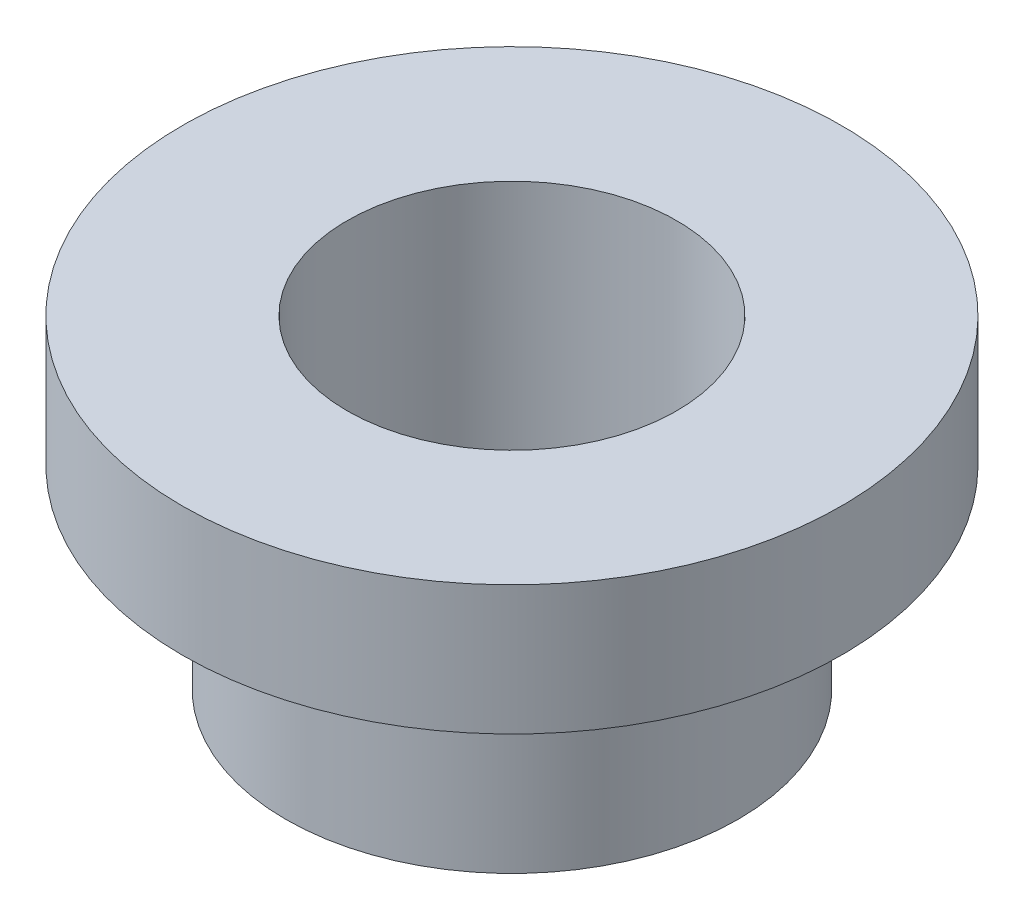
ISO-10303-21;
HEADER;
FILE_DESCRIPTION(('STEP AP214'),'2;1');
FILE_NAME('part.step','',(''),(''),'','','');
FILE_SCHEMA(('AUTOMOTIVE_DESIGN { 1 0 10303 214 1 1 1 1 }'));
ENDSEC;
DATA;
#1=APPLICATION_CONTEXT('core data for automotive mechanical design processes');
#2=APPLICATION_PROTOCOL_DEFINITION('international standard','automotive_design',2000,#1);
#3=PRODUCT_CONTEXT('',#1,'mechanical');
#4=PRODUCT('Part','Part','',(#3));
#5=PRODUCT_RELATED_PRODUCT_CATEGORY('part','',(#4));
#6=PRODUCT_DEFINITION_FORMATION('','',#4);
#7=PRODUCT_DEFINITION_CONTEXT('part definition',#1,'design');
#8=PRODUCT_DEFINITION('design','',#6,#7);
#9=PRODUCT_DEFINITION_SHAPE('','',#8);
#10=(LENGTH_UNIT() NAMED_UNIT(*) SI_UNIT(.MILLI.,.METRE.));
#11=(NAMED_UNIT(*) PLANE_ANGLE_UNIT() SI_UNIT($,.RADIAN.));
#12=(NAMED_UNIT(*) SI_UNIT($,.STERADIAN.) SOLID_ANGLE_UNIT());
#13=UNCERTAINTY_MEASURE_WITH_UNIT(LENGTH_MEASURE(1.E-05),#10,'distance_accuracy_value','');
#14=(GEOMETRIC_REPRESENTATION_CONTEXT(3) GLOBAL_UNCERTAINTY_ASSIGNED_CONTEXT((#13)) GLOBAL_UNIT_ASSIGNED_CONTEXT((#10,
#11,#12)) REPRESENTATION_CONTEXT('',''));
#15=CARTESIAN_POINT('',(0.,0.,0.));
#16=DIRECTION('',(0.,0.,1.));
#17=DIRECTION('',(1.,0.,0.));
#18=AXIS2_PLACEMENT_3D('',#15,#16,#17);
#19=CARTESIAN_POINT('',(0.,8.76171662125341,0.));
#20=DIRECTION('',(0.,1.,0.));
#21=DIRECTION('',(0.,0.,1.));
#22=AXIS2_PLACEMENT_3D('',#19,#20,#21);
#23=CYLINDRICAL_SURFACE('',#22,2.55);
#24=CARTESIAN_POINT('',(0.,-2.5,0.));
#25=DIRECTION('',(0.,1.,0.));
#26=DIRECTION('',(0.,0.,1.));
#27=AXIS2_PLACEMENT_3D('',#24,#25,#26);
#28=CIRCLE('',#27,2.55);
#29=CARTESIAN_POINT('',(0.,-2.5,2.55));
#30=VERTEX_POINT('',#29);
#31=EDGE_CURVE('E55',#30,#30,#28,.T.);
#32=ORIENTED_EDGE('',*,*,#31,.F.);
#33=EDGE_LOOP('',(#32));
#34=FACE_BOUND('',#33,.T.);
#35=CARTESIAN_POINT('',(0.,2.5,0.));
#36=DIRECTION('',(0.,1.,0.));
#37=DIRECTION('',(0.,0.,1.));
#38=AXIS2_PLACEMENT_3D('',#35,#36,#37);
#39=CIRCLE('',#38,2.55);
#40=CARTESIAN_POINT('',(0.,2.5,2.55));
#41=VERTEX_POINT('',#40);
#42=EDGE_CURVE('E10',#41,#41,#39,.T.);
#43=ORIENTED_EDGE('',*,*,#42,.T.);
#44=EDGE_LOOP('',(#43));
#45=FACE_BOUND('',#44,.T.);
#46=ADVANCED_FACE('F33',(#34,#45),#23,.F.);
#47=CARTESIAN_POINT('',(0.,2.5,-2.55));
#48=DIRECTION('',(0.,-1.,0.));
#49=DIRECTION('',(0.,0.,-1.));
#50=AXIS2_PLACEMENT_3D('',#47,#48,#49);
#51=PLANE('',#50);
#52=ORIENTED_EDGE('',*,*,#42,.F.);
#53=EDGE_LOOP('',(#52));
#54=FACE_BOUND('',#53,.T.);
#55=CARTESIAN_POINT('',(0.,2.5,0.));
#56=DIRECTION('',(0.,1.,0.));
#57=DIRECTION('',(0.,0.,1.));
#58=AXIS2_PLACEMENT_3D('',#55,#56,#57);
#59=CIRCLE('',#58,5.1);
#60=CARTESIAN_POINT('',(0.,2.5,5.1));
#61=VERTEX_POINT('',#60);
#62=EDGE_CURVE('E39',#61,#61,#59,.T.);
#63=ORIENTED_EDGE('',*,*,#62,.T.);
#64=EDGE_LOOP('',(#63));
#65=FACE_BOUND('',#64,.T.);
#66=ADVANCED_FACE('F62',(#54,#65),#51,.F.);
#67=CARTESIAN_POINT('',(0.,8.76171662125341,0.));
#68=DIRECTION('',(0.,1.,0.));
#69=DIRECTION('',(0.,0.,1.));
#70=AXIS2_PLACEMENT_3D('',#67,#68,#69);
#71=CYLINDRICAL_SURFACE('',#70,5.1);
#72=ORIENTED_EDGE('',*,*,#62,.F.);
#73=EDGE_LOOP('',(#72));
#74=FACE_BOUND('',#73,.T.);
#75=CARTESIAN_POINT('',(0.,0.5,0.));
#76=DIRECTION('',(0.,1.,0.));
#77=DIRECTION('',(0.,0.,1.));
#78=AXIS2_PLACEMENT_3D('',#75,#76,#77);
#79=CIRCLE('',#78,5.1);
#80=CARTESIAN_POINT('',(0.,0.499999999999999,5.1));
#81=VERTEX_POINT('',#80);
#82=EDGE_CURVE('E43',#81,#81,#79,.T.);
#83=ORIENTED_EDGE('',*,*,#82,.T.);
#84=EDGE_LOOP('',(#83));
#85=FACE_BOUND('',#84,.T.);
#86=ADVANCED_FACE('F66',(#74,#85),#71,.T.);
#87=CARTESIAN_POINT('',(0.,0.500000000000002,-5.1));
#88=DIRECTION('',(0.,1.,0.));
#89=DIRECTION('',(0.,0.,1.));
#90=AXIS2_PLACEMENT_3D('',#87,#88,#89);
#91=PLANE('',#90);
#92=ORIENTED_EDGE('',*,*,#82,.F.);
#93=EDGE_LOOP('',(#92));
#94=FACE_BOUND('',#93,.T.);
#95=CARTESIAN_POINT('',(0.,0.499999999999999,0.));
#96=DIRECTION('',(0.,1.,0.));
#97=DIRECTION('',(0.,0.,1.));
#98=AXIS2_PLACEMENT_3D('',#95,#96,#97);
#99=CIRCLE('',#98,3.5);
#100=CARTESIAN_POINT('',(0.,0.499999999999998,3.5));
#101=VERTEX_POINT('',#100);
#102=EDGE_CURVE('E47',#101,#101,#99,.T.);
#103=ORIENTED_EDGE('',*,*,#102,.T.);
#104=EDGE_LOOP('',(#103));
#105=FACE_BOUND('',#104,.T.);
#106=ADVANCED_FACE('F71',(#94,#105),#91,.F.);
#107=CARTESIAN_POINT('',(0.,8.76171662125341,0.));
#108=DIRECTION('',(0.,1.,0.));
#109=DIRECTION('',(0.,0.,1.));
#110=AXIS2_PLACEMENT_3D('',#107,#108,#109);
#111=CYLINDRICAL_SURFACE('',#110,3.5);
#112=ORIENTED_EDGE('',*,*,#102,.F.);
#113=EDGE_LOOP('',(#112));
#114=FACE_BOUND('',#113,.T.);
#115=CARTESIAN_POINT('',(0.,-2.5,0.));
#116=DIRECTION('',(0.,1.,0.));
#117=DIRECTION('',(0.,0.,1.));
#118=AXIS2_PLACEMENT_3D('',#115,#116,#117);
#119=CIRCLE('',#118,3.5);
#120=CARTESIAN_POINT('',(0.,-2.5,3.5));
#121=VERTEX_POINT('',#120);
#122=EDGE_CURVE('E52',#121,#121,#119,.T.);
#123=ORIENTED_EDGE('',*,*,#122,.T.);
#124=EDGE_LOOP('',(#123));
#125=FACE_BOUND('',#124,.T.);
#126=ADVANCED_FACE('F77',(#114,#125),#111,.T.);
#127=CARTESIAN_POINT('',(0.,-2.5,-3.5));
#128=DIRECTION('',(0.,1.,0.));
#129=DIRECTION('',(0.,0.,1.));
#130=AXIS2_PLACEMENT_3D('',#127,#128,#129);
#131=PLANE('',#130);
#132=ORIENTED_EDGE('',*,*,#122,.F.);
#133=EDGE_LOOP('',(#132));
#134=FACE_BOUND('',#133,.T.);
#135=ORIENTED_EDGE('',*,*,#31,.T.);
#136=EDGE_LOOP('',(#135));
#137=FACE_BOUND('',#136,.T.);
#138=ADVANCED_FACE('F59',(#134,#137),#131,.F.);
#139=CLOSED_SHELL('',(#46,#66,#86,#106,#126,#138));
#140=MANIFOLD_SOLID_BREP('B2',#139);
#141=ADVANCED_BREP_SHAPE_REPRESENTATION('',(#18,#140),#14);
#142=SHAPE_DEFINITION_REPRESENTATION(#9,#141);
ENDSEC;
END-ISO-10303-21;
